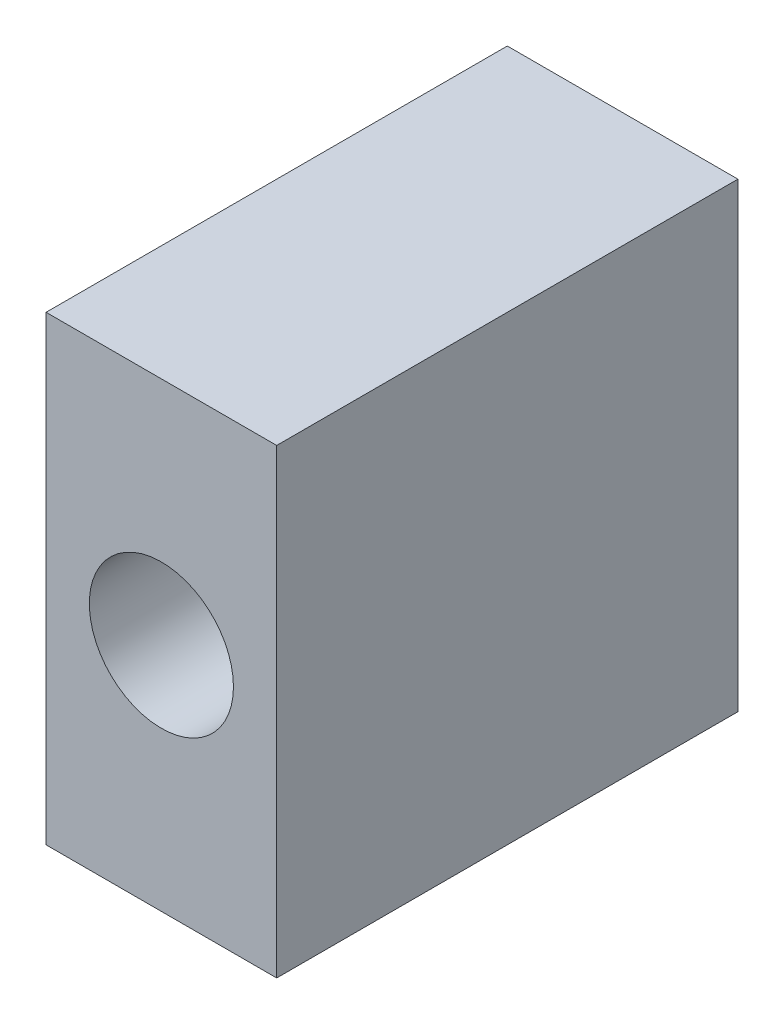
ISO-10303-21;
HEADER;
FILE_DESCRIPTION(('STEP AP214'),'2;1');
FILE_NAME('part.step','',(''),(''),'','','');
FILE_SCHEMA(('AUTOMOTIVE_DESIGN { 1 0 10303 214 1 1 1 1 }'));
ENDSEC;
DATA;
#1=APPLICATION_CONTEXT('core data for automotive mechanical design processes');
#2=APPLICATION_PROTOCOL_DEFINITION('international standard','automotive_design',2000,#1);
#3=PRODUCT_CONTEXT('',#1,'mechanical');
#4=PRODUCT('Part','Part','',(#3));
#5=PRODUCT_RELATED_PRODUCT_CATEGORY('part','',(#4));
#6=PRODUCT_DEFINITION_FORMATION('','',#4);
#7=PRODUCT_DEFINITION_CONTEXT('part definition',#1,'design');
#8=PRODUCT_DEFINITION('design','',#6,#7);
#9=PRODUCT_DEFINITION_SHAPE('','',#8);
#10=(LENGTH_UNIT() NAMED_UNIT(*) SI_UNIT(.MILLI.,.METRE.));
#11=(NAMED_UNIT(*) PLANE_ANGLE_UNIT() SI_UNIT($,.RADIAN.));
#12=(NAMED_UNIT(*) SI_UNIT($,.STERADIAN.) SOLID_ANGLE_UNIT());
#13=UNCERTAINTY_MEASURE_WITH_UNIT(LENGTH_MEASURE(1.E-05),#10,'distance_accuracy_value','');
#14=(GEOMETRIC_REPRESENTATION_CONTEXT(3) GLOBAL_UNCERTAINTY_ASSIGNED_CONTEXT((#13)) GLOBAL_UNIT_ASSIGNED_CONTEXT((#10,
#11,#12)) REPRESENTATION_CONTEXT('',''));
#15=CARTESIAN_POINT('',(0.,0.,0.));
#16=DIRECTION('',(0.,0.,1.));
#17=DIRECTION('',(1.,0.,0.));
#18=AXIS2_PLACEMENT_3D('',#15,#16,#17);
#19=CARTESIAN_POINT('',(0.,0.,8.));
#20=DIRECTION('',(0.,0.,1.));
#21=DIRECTION('',(1.,0.,0.));
#22=AXIS2_PLACEMENT_3D('',#19,#20,#21);
#23=PLANE('',#22);
#24=DIRECTION('',(0.,-1.,0.));
#25=VECTOR('',#24,1.);
#26=CARTESIAN_POINT('',(-2.,4.,8.));
#27=LINE('',#26,#25);
#28=CARTESIAN_POINT('',(-2.,4.,8.));
#29=VERTEX_POINT('',#28);
#30=CARTESIAN_POINT('',(-2.,-4.,8.));
#31=VERTEX_POINT('',#30);
#32=EDGE_CURVE('E92',#29,#31,#27,.T.);
#33=ORIENTED_EDGE('',*,*,#32,.T.);
#34=DIRECTION('',(1.,0.,0.));
#35=VECTOR('',#34,1.);
#36=CARTESIAN_POINT('',(-2.,-4.,8.));
#37=LINE('',#36,#35);
#38=CARTESIAN_POINT('',(2.,-4.,8.));
#39=VERTEX_POINT('',#38);
#40=EDGE_CURVE('E87',#31,#39,#37,.T.);
#41=ORIENTED_EDGE('',*,*,#40,.T.);
#42=DIRECTION('',(0.,1.,0.));
#43=VECTOR('',#42,1.);
#44=CARTESIAN_POINT('',(2.,4.,8.));
#45=LINE('',#44,#43);
#46=CARTESIAN_POINT('',(2.,4.,8.));
#47=VERTEX_POINT('',#46);
#48=EDGE_CURVE('E90',#39,#47,#45,.T.);
#49=ORIENTED_EDGE('',*,*,#48,.T.);
#50=DIRECTION('',(-1.,0.,0.));
#51=VECTOR('',#50,1.);
#52=CARTESIAN_POINT('',(-2.,4.,8.));
#53=LINE('',#52,#51);
#54=EDGE_CURVE('E57',#47,#29,#53,.T.);
#55=ORIENTED_EDGE('',*,*,#54,.T.);
#56=EDGE_LOOP('',(#33,#41,#49,#55));
#57=FACE_BOUND('',#56,.T.);
#58=CARTESIAN_POINT('',(0.,0.,8.));
#59=DIRECTION('',(0.,0.,1.));
#60=DIRECTION('',(1.,0.,0.));
#61=AXIS2_PLACEMENT_3D('',#58,#59,#60);
#62=CIRCLE('',#61,1.25);
#63=CARTESIAN_POINT('',(1.25,0.,8.));
#64=VERTEX_POINT('',#63);
#65=EDGE_CURVE('E112',#64,#64,#62,.T.);
#66=ORIENTED_EDGE('',*,*,#65,.F.);
#67=EDGE_LOOP('',(#66));
#68=FACE_BOUND('',#67,.T.);
#69=ADVANCED_FACE('F39',(#57,#68),#23,.T.);
#70=CARTESIAN_POINT('',(0.,0.,0.));
#71=DIRECTION('',(0.,0.,1.));
#72=DIRECTION('',(1.,0.,0.));
#73=AXIS2_PLACEMENT_3D('',#70,#71,#72);
#74=PLANE('',#73);
#75=DIRECTION('',(0.,-1.,0.));
#76=VECTOR('',#75,1.);
#77=CARTESIAN_POINT('',(-2.,4.,0.));
#78=LINE('',#77,#76);
#79=CARTESIAN_POINT('',(-2.,4.,0.));
#80=VERTEX_POINT('',#79);
#81=CARTESIAN_POINT('',(-2.,-4.,0.));
#82=VERTEX_POINT('',#81);
#83=EDGE_CURVE('E108',#80,#82,#78,.T.);
#84=ORIENTED_EDGE('',*,*,#83,.F.);
#85=DIRECTION('',(-1.,0.,0.));
#86=VECTOR('',#85,1.);
#87=CARTESIAN_POINT('',(-2.,4.,0.));
#88=LINE('',#87,#86);
#89=CARTESIAN_POINT('',(2.,4.,0.));
#90=VERTEX_POINT('',#89);
#91=EDGE_CURVE('E80',#90,#80,#88,.T.);
#92=ORIENTED_EDGE('',*,*,#91,.F.);
#93=DIRECTION('',(0.,1.,0.));
#94=VECTOR('',#93,1.);
#95=CARTESIAN_POINT('',(2.,4.,0.));
#96=LINE('',#95,#94);
#97=CARTESIAN_POINT('',(2.,-4.,0.));
#98=VERTEX_POINT('',#97);
#99=EDGE_CURVE('E74',#98,#90,#96,.T.);
#100=ORIENTED_EDGE('',*,*,#99,.F.);
#101=DIRECTION('',(1.,0.,0.));
#102=VECTOR('',#101,1.);
#103=CARTESIAN_POINT('',(-2.,-4.,0.));
#104=LINE('',#103,#102);
#105=EDGE_CURVE('E97',#82,#98,#104,.T.);
#106=ORIENTED_EDGE('',*,*,#105,.F.);
#107=EDGE_LOOP('',(#84,#92,#100,#106));
#108=FACE_BOUND('',#107,.T.);
#109=CARTESIAN_POINT('',(0.,0.,0.));
#110=DIRECTION('',(0.,0.,1.));
#111=DIRECTION('',(1.,0.,0.));
#112=AXIS2_PLACEMENT_3D('',#109,#110,#111);
#113=CIRCLE('',#112,1.25);
#114=CARTESIAN_POINT('',(1.25,0.,0.));
#115=VERTEX_POINT('',#114);
#116=EDGE_CURVE('E130',#115,#115,#113,.T.);
#117=ORIENTED_EDGE('',*,*,#116,.T.);
#118=EDGE_LOOP('',(#117));
#119=FACE_BOUND('',#118,.T.);
#120=ADVANCED_FACE('F125',(#108,#119),#74,.F.);
#121=CARTESIAN_POINT('',(-2.,4.,8.));
#122=DIRECTION('',(1.,0.,0.));
#123=DIRECTION('',(0.,0.,-1.));
#124=AXIS2_PLACEMENT_3D('',#121,#122,#123);
#125=PLANE('',#124);
#126=ORIENTED_EDGE('',*,*,#83,.T.);
#127=DIRECTION('',(0.,0.,-1.));
#128=VECTOR('',#127,1.);
#129=CARTESIAN_POINT('',(-2.,-4.,8.));
#130=LINE('',#129,#128);
#131=EDGE_CURVE('E11',#31,#82,#130,.T.);
#132=ORIENTED_EDGE('',*,*,#131,.F.);
#133=ORIENTED_EDGE('',*,*,#32,.F.);
#134=DIRECTION('',(0.,0.,-1.));
#135=VECTOR('',#134,1.);
#136=CARTESIAN_POINT('',(-2.,4.,8.));
#137=LINE('',#136,#135);
#138=EDGE_CURVE('E104',#29,#80,#137,.T.);
#139=ORIENTED_EDGE('',*,*,#138,.T.);
#140=EDGE_LOOP('',(#126,#132,#133,#139));
#141=FACE_BOUND('',#140,.T.);
#142=ADVANCED_FACE('F41',(#141),#125,.F.);
#143=CARTESIAN_POINT('',(-2.,-4.,8.));
#144=DIRECTION('',(0.,1.,0.));
#145=DIRECTION('',(0.,0.,1.));
#146=AXIS2_PLACEMENT_3D('',#143,#144,#145);
#147=PLANE('',#146);
#148=ORIENTED_EDGE('',*,*,#105,.T.);
#149=DIRECTION('',(0.,0.,-1.));
#150=VECTOR('',#149,1.);
#151=CARTESIAN_POINT('',(2.,-4.,8.));
#152=LINE('',#151,#150);
#153=EDGE_CURVE('E49',#39,#98,#152,.T.);
#154=ORIENTED_EDGE('',*,*,#153,.F.);
#155=ORIENTED_EDGE('',*,*,#40,.F.);
#156=ORIENTED_EDGE('',*,*,#131,.T.);
#157=EDGE_LOOP('',(#148,#154,#155,#156));
#158=FACE_BOUND('',#157,.T.);
#159=ADVANCED_FACE('F96',(#158),#147,.F.);
#160=CARTESIAN_POINT('',(2.,4.,8.));
#161=DIRECTION('',(-1.,0.,0.));
#162=DIRECTION('',(0.,0.,1.));
#163=AXIS2_PLACEMENT_3D('',#160,#161,#162);
#164=PLANE('',#163);
#165=ORIENTED_EDGE('',*,*,#99,.T.);
#166=DIRECTION('',(0.,0.,-1.));
#167=VECTOR('',#166,1.);
#168=CARTESIAN_POINT('',(2.,4.,8.));
#169=LINE('',#168,#167);
#170=EDGE_CURVE('E99',#47,#90,#169,.T.);
#171=ORIENTED_EDGE('',*,*,#170,.F.);
#172=ORIENTED_EDGE('',*,*,#48,.F.);
#173=ORIENTED_EDGE('',*,*,#153,.T.);
#174=EDGE_LOOP('',(#165,#171,#172,#173));
#175=FACE_BOUND('',#174,.T.);
#176=ADVANCED_FACE('F100',(#175),#164,.F.);
#177=CARTESIAN_POINT('',(-2.,4.,8.));
#178=DIRECTION('',(0.,-1.,0.));
#179=DIRECTION('',(0.,0.,-1.));
#180=AXIS2_PLACEMENT_3D('',#177,#178,#179);
#181=PLANE('',#180);
#182=ORIENTED_EDGE('',*,*,#91,.T.);
#183=ORIENTED_EDGE('',*,*,#138,.F.);
#184=ORIENTED_EDGE('',*,*,#54,.F.);
#185=ORIENTED_EDGE('',*,*,#170,.T.);
#186=EDGE_LOOP('',(#182,#183,#184,#185));
#187=FACE_BOUND('',#186,.T.);
#188=ADVANCED_FACE('F122',(#187),#181,.F.);
#189=CARTESIAN_POINT('',(0.,0.,8.));
#190=DIRECTION('',(0.,0.,-1.));
#191=DIRECTION('',(-1.,0.,0.));
#192=AXIS2_PLACEMENT_3D('',#189,#190,#191);
#193=CYLINDRICAL_SURFACE('',#192,1.25);
#194=ORIENTED_EDGE('',*,*,#65,.T.);
#195=EDGE_LOOP('',(#194));
#196=FACE_BOUND('',#195,.T.);
#197=ORIENTED_EDGE('',*,*,#116,.F.);
#198=EDGE_LOOP('',(#197));
#199=FACE_BOUND('',#198,.T.);
#200=ADVANCED_FACE('F138',(#196,#199),#193,.F.);
#201=CLOSED_SHELL('',(#69,#120,#142,#159,#176,#188,#200));
#202=MANIFOLD_SOLID_BREP('B2',#201);
#203=ADVANCED_BREP_SHAPE_REPRESENTATION('',(#18,#202),#14);
#204=SHAPE_DEFINITION_REPRESENTATION(#9,#203);
ENDSEC;
END-ISO-10303-21;
